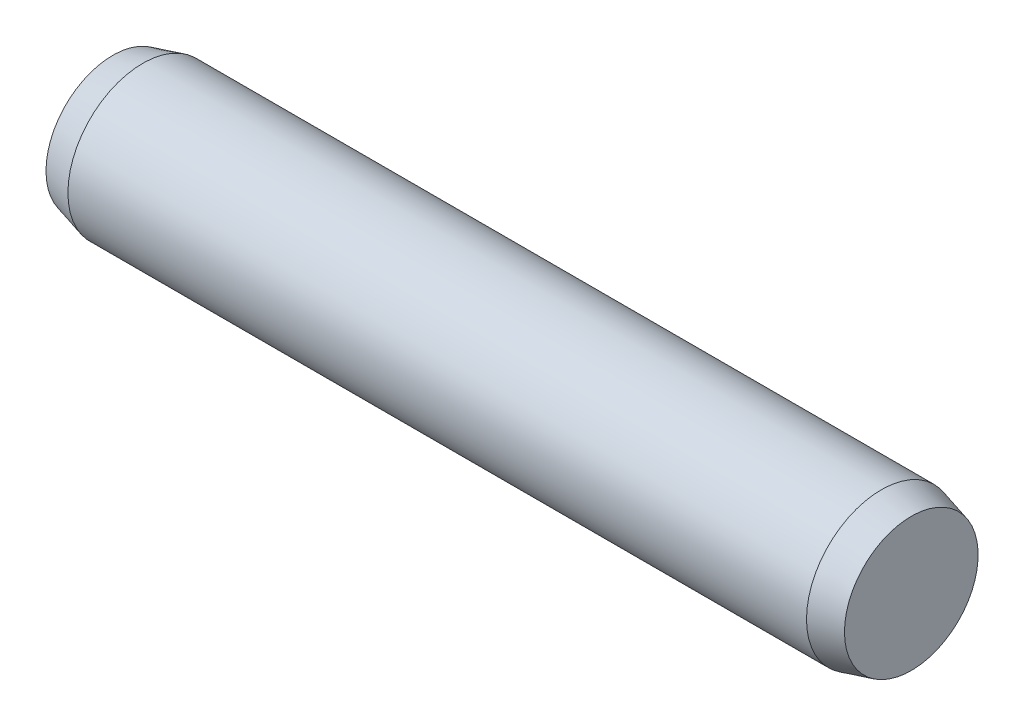
ISO-10303-21;
HEADER;
FILE_DESCRIPTION(('STEP AP214'),'2;1');
FILE_NAME('part.step','',(''),(''),'','','');
FILE_SCHEMA(('AUTOMOTIVE_DESIGN { 1 0 10303 214 1 1 1 1 }'));
ENDSEC;
DATA;
#1=APPLICATION_CONTEXT('core data for automotive mechanical design processes');
#2=APPLICATION_PROTOCOL_DEFINITION('international standard','automotive_design',2000,#1);
#3=PRODUCT_CONTEXT('',#1,'mechanical');
#4=PRODUCT('Part','Part','',(#3));
#5=PRODUCT_RELATED_PRODUCT_CATEGORY('part','',(#4));
#6=PRODUCT_DEFINITION_FORMATION('','',#4);
#7=PRODUCT_DEFINITION_CONTEXT('part definition',#1,'design');
#8=PRODUCT_DEFINITION('design','',#6,#7);
#9=PRODUCT_DEFINITION_SHAPE('','',#8);
#10=(LENGTH_UNIT() NAMED_UNIT(*) SI_UNIT(.MILLI.,.METRE.));
#11=(NAMED_UNIT(*) PLANE_ANGLE_UNIT() SI_UNIT($,.RADIAN.));
#12=(NAMED_UNIT(*) SI_UNIT($,.STERADIAN.) SOLID_ANGLE_UNIT());
#13=UNCERTAINTY_MEASURE_WITH_UNIT(LENGTH_MEASURE(1.E-05),#10,'distance_accuracy_value','');
#14=(GEOMETRIC_REPRESENTATION_CONTEXT(3) GLOBAL_UNCERTAINTY_ASSIGNED_CONTEXT((#13)) GLOBAL_UNIT_ASSIGNED_CONTEXT((#10,
#11,#12)) REPRESENTATION_CONTEXT('',''));
#15=CARTESIAN_POINT('',(0.,0.,0.));
#16=DIRECTION('',(0.,0.,1.));
#17=DIRECTION('',(1.,0.,0.));
#18=AXIS2_PLACEMENT_3D('',#15,#16,#17);
#19=CARTESIAN_POINT('',(0.,2.67846096908263,0.));
#20=DIRECTION('',(1.,0.,0.));
#21=DIRECTION('',(0.,0.,-1.));
#22=AXIS2_PLACEMENT_3D('',#19,#20,#21);
#23=PLANE('',#22);
#24=CARTESIAN_POINT('',(0.,0.,0.));
#25=DIRECTION('',(-1.,0.,0.));
#26=DIRECTION('',(0.,0.,1.));
#27=AXIS2_PLACEMENT_3D('',#24,#25,#26);
#28=CIRCLE('',#27,2.67846096908263);
#29=CARTESIAN_POINT('',(0.,0.,2.67846096908263));
#30=VERTEX_POINT('',#29);
#31=EDGE_CURVE('E46',#30,#30,#28,.T.);
#32=ORIENTED_EDGE('',*,*,#31,.T.);
#33=EDGE_LOOP('',(#32));
#34=FACE_BOUND('',#33,.T.);
#35=ADVANCED_FACE('F32',(#34),#23,.F.);
#36=CARTESIAN_POINT('',(32.,0.,0.));
#37=DIRECTION('',(-1.,0.,0.));
#38=DIRECTION('',(0.,0.,1.));
#39=AXIS2_PLACEMENT_3D('',#36,#37,#38);
#40=PLANE('',#39);
#41=CARTESIAN_POINT('',(32.,0.,0.));
#42=DIRECTION('',(-1.,0.,0.));
#43=DIRECTION('',(0.,0.,1.));
#44=AXIS2_PLACEMENT_3D('',#41,#42,#43);
#45=CIRCLE('',#44,2.67846096908263);
#46=CARTESIAN_POINT('',(32.,0.,2.67846096908263));
#47=VERTEX_POINT('',#46);
#48=EDGE_CURVE('E10',#47,#47,#45,.T.);
#49=ORIENTED_EDGE('',*,*,#48,.F.);
#50=EDGE_LOOP('',(#49));
#51=FACE_BOUND('',#50,.T.);
#52=ADVANCED_FACE('F66',(#51),#40,.F.);
#53=CARTESIAN_POINT('',(32.,0.,0.));
#54=DIRECTION('',(-1.,0.,0.));
#55=DIRECTION('',(0.,0.,1.));
#56=AXIS2_PLACEMENT_3D('',#53,#54,#55);
#57=CONICAL_SURFACE('',#56,2.67846096908263,0.261799387799148);
#58=CARTESIAN_POINT('',(30.8,0.,0.));
#59=DIRECTION('',(-1.,0.,0.));
#60=DIRECTION('',(0.,0.,1.));
#61=AXIS2_PLACEMENT_3D('',#58,#59,#60);
#62=CIRCLE('',#61,2.99999999999998);
#63=CARTESIAN_POINT('',(30.8,0.,2.99999999999998));
#64=VERTEX_POINT('',#63);
#65=EDGE_CURVE('E38',#64,#64,#62,.T.);
#66=ORIENTED_EDGE('',*,*,#65,.F.);
#67=EDGE_LOOP('',(#66));
#68=FACE_BOUND('',#67,.T.);
#69=ORIENTED_EDGE('',*,*,#48,.T.);
#70=EDGE_LOOP('',(#69));
#71=FACE_BOUND('',#70,.T.);
#72=ADVANCED_FACE('F61',(#68,#71),#57,.T.);
#73=CARTESIAN_POINT('',(-6.35,0.,0.));
#74=DIRECTION('',(-1.,0.,0.));
#75=DIRECTION('',(0.,0.,1.));
#76=AXIS2_PLACEMENT_3D('',#73,#74,#75);
#77=CYLINDRICAL_SURFACE('',#76,2.99999999999997);
#78=CARTESIAN_POINT('',(1.2,0.,0.));
#79=DIRECTION('',(-1.,0.,0.));
#80=DIRECTION('',(0.,0.,1.));
#81=AXIS2_PLACEMENT_3D('',#78,#79,#80);
#82=CIRCLE('',#81,2.99999999999997);
#83=CARTESIAN_POINT('',(1.2,0.,2.99999999999997));
#84=VERTEX_POINT('',#83);
#85=EDGE_CURVE('E42',#84,#84,#82,.T.);
#86=ORIENTED_EDGE('',*,*,#85,.F.);
#87=EDGE_LOOP('',(#86));
#88=FACE_BOUND('',#87,.T.);
#89=ORIENTED_EDGE('',*,*,#65,.T.);
#90=EDGE_LOOP('',(#89));
#91=FACE_BOUND('',#90,.T.);
#92=ADVANCED_FACE('F56',(#88,#91),#77,.T.);
#93=CARTESIAN_POINT('',(1.2,0.,0.));
#94=DIRECTION('',(1.,0.,0.));
#95=DIRECTION('',(0.,0.,-1.));
#96=AXIS2_PLACEMENT_3D('',#93,#94,#95);
#97=CONICAL_SURFACE('',#96,2.99999999999997,0.261799387799146);
#98=ORIENTED_EDGE('',*,*,#31,.F.);
#99=EDGE_LOOP('',(#98));
#100=FACE_BOUND('',#99,.T.);
#101=ORIENTED_EDGE('',*,*,#85,.T.);
#102=EDGE_LOOP('',(#101));
#103=FACE_BOUND('',#102,.T.);
#104=ADVANCED_FACE('F53',(#100,#103),#97,.T.);
#105=CLOSED_SHELL('',(#35,#52,#72,#92,#104));
#106=MANIFOLD_SOLID_BREP('B2',#105);
#107=ADVANCED_BREP_SHAPE_REPRESENTATION('',(#18,#106),#14);
#108=SHAPE_DEFINITION_REPRESENTATION(#9,#107);
ENDSEC;
END-ISO-10303-21;
